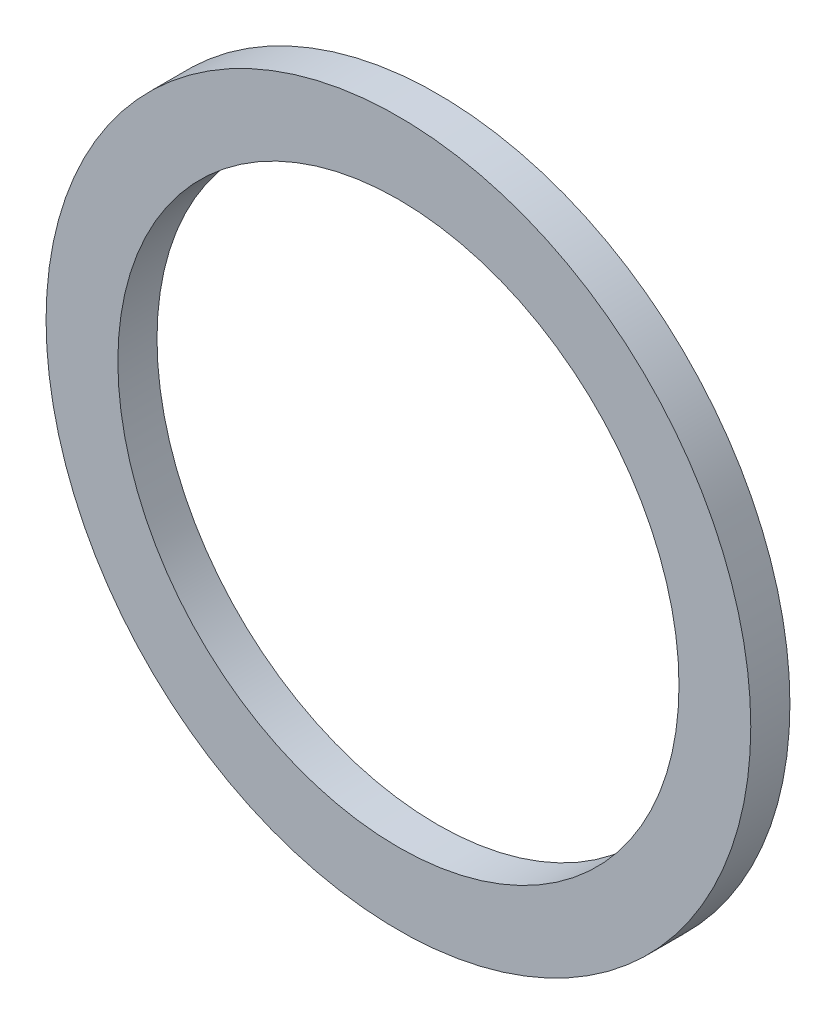
ISO-10303-21;
HEADER;
FILE_DESCRIPTION(('STEP AP214'),'2;1');
FILE_NAME('part.step','',(''),(''),'','','');
FILE_SCHEMA(('AUTOMOTIVE_DESIGN { 1 0 10303 214 1 1 1 1 }'));
ENDSEC;
DATA;
#1=APPLICATION_CONTEXT('core data for automotive mechanical design processes');
#2=APPLICATION_PROTOCOL_DEFINITION('international standard','automotive_design',2000,#1);
#3=PRODUCT_CONTEXT('',#1,'mechanical');
#4=PRODUCT('Part','Part','',(#3));
#5=PRODUCT_RELATED_PRODUCT_CATEGORY('part','',(#4));
#6=PRODUCT_DEFINITION_FORMATION('','',#4);
#7=PRODUCT_DEFINITION_CONTEXT('part definition',#1,'design');
#8=PRODUCT_DEFINITION('design','',#6,#7);
#9=PRODUCT_DEFINITION_SHAPE('','',#8);
#10=(LENGTH_UNIT() NAMED_UNIT(*) SI_UNIT(.MILLI.,.METRE.));
#11=(NAMED_UNIT(*) PLANE_ANGLE_UNIT() SI_UNIT($,.RADIAN.));
#12=(NAMED_UNIT(*) SI_UNIT($,.STERADIAN.) SOLID_ANGLE_UNIT());
#13=UNCERTAINTY_MEASURE_WITH_UNIT(LENGTH_MEASURE(1.E-05),#10,'distance_accuracy_value','');
#14=(GEOMETRIC_REPRESENTATION_CONTEXT(3) GLOBAL_UNCERTAINTY_ASSIGNED_CONTEXT((#13)) GLOBAL_UNIT_ASSIGNED_CONTEXT((#10,
#11,#12)) REPRESENTATION_CONTEXT('',''));
#15=CARTESIAN_POINT('',(0.,0.,0.));
#16=DIRECTION('',(0.,0.,1.));
#17=DIRECTION('',(1.,0.,0.));
#18=AXIS2_PLACEMENT_3D('',#15,#16,#17);
#19=CARTESIAN_POINT('',(0.,0.,1.5));
#20=DIRECTION('',(0.,0.,1.));
#21=DIRECTION('',(1.,0.,0.));
#22=AXIS2_PLACEMENT_3D('',#19,#20,#21);
#23=PLANE('',#22);
#24=CARTESIAN_POINT('',(0.,0.,1.5));
#25=DIRECTION('',(0.,0.,1.));
#26=DIRECTION('',(1.,0.,0.));
#27=AXIS2_PLACEMENT_3D('',#24,#25,#26);
#28=CIRCLE('',#27,13.5);
#29=CARTESIAN_POINT('',(13.5,0.,1.5));
#30=VERTEX_POINT('',#29);
#31=EDGE_CURVE('E10',#30,#30,#28,.T.);
#32=ORIENTED_EDGE('',*,*,#31,.T.);
#33=EDGE_LOOP('',(#32));
#34=FACE_BOUND('',#33,.T.);
#35=CARTESIAN_POINT('',(0.,0.,1.5));
#36=DIRECTION('',(0.,0.,1.));
#37=DIRECTION('',(1.,0.,0.));
#38=AXIS2_PLACEMENT_3D('',#35,#36,#37);
#39=CIRCLE('',#38,10.75);
#40=CARTESIAN_POINT('',(10.75,0.,1.5));
#41=VERTEX_POINT('',#40);
#42=EDGE_CURVE('E42',#41,#41,#39,.T.);
#43=ORIENTED_EDGE('',*,*,#42,.F.);
#44=EDGE_LOOP('',(#43));
#45=FACE_BOUND('',#44,.T.);
#46=ADVANCED_FACE('F31',(#34,#45),#23,.T.);
#47=CARTESIAN_POINT('',(0.,0.,0.));
#48=DIRECTION('',(0.,0.,1.));
#49=DIRECTION('',(1.,0.,0.));
#50=AXIS2_PLACEMENT_3D('',#47,#48,#49);
#51=PLANE('',#50);
#52=CARTESIAN_POINT('',(0.,0.,0.));
#53=DIRECTION('',(0.,0.,1.));
#54=DIRECTION('',(1.,0.,0.));
#55=AXIS2_PLACEMENT_3D('',#52,#53,#54);
#56=CIRCLE('',#55,13.5);
#57=CARTESIAN_POINT('',(13.5,0.,0.));
#58=VERTEX_POINT('',#57);
#59=EDGE_CURVE('E35',#58,#58,#56,.T.);
#60=ORIENTED_EDGE('',*,*,#59,.F.);
#61=EDGE_LOOP('',(#60));
#62=FACE_BOUND('',#61,.T.);
#63=CARTESIAN_POINT('',(0.,0.,0.));
#64=DIRECTION('',(0.,0.,1.));
#65=DIRECTION('',(1.,0.,0.));
#66=AXIS2_PLACEMENT_3D('',#63,#64,#65);
#67=CIRCLE('',#66,10.75);
#68=CARTESIAN_POINT('',(10.75,0.,0.));
#69=VERTEX_POINT('',#68);
#70=EDGE_CURVE('E44',#69,#69,#67,.T.);
#71=ORIENTED_EDGE('',*,*,#70,.T.);
#72=EDGE_LOOP('',(#71));
#73=FACE_BOUND('',#72,.T.);
#74=ADVANCED_FACE('F54',(#62,#73),#51,.F.);
#75=CARTESIAN_POINT('',(0.,0.,1.5));
#76=DIRECTION('',(0.,0.,-1.));
#77=DIRECTION('',(-1.,0.,0.));
#78=AXIS2_PLACEMENT_3D('',#75,#76,#77);
#79=CYLINDRICAL_SURFACE('',#78,13.5);
#80=ORIENTED_EDGE('',*,*,#31,.F.);
#81=EDGE_LOOP('',(#80));
#82=FACE_BOUND('',#81,.T.);
#83=ORIENTED_EDGE('',*,*,#59,.T.);
#84=EDGE_LOOP('',(#83));
#85=FACE_BOUND('',#84,.T.);
#86=ADVANCED_FACE('F33',(#82,#85),#79,.T.);
#87=CARTESIAN_POINT('',(0.,0.,1.5));
#88=DIRECTION('',(0.,0.,-1.));
#89=DIRECTION('',(-1.,0.,0.));
#90=AXIS2_PLACEMENT_3D('',#87,#88,#89);
#91=CYLINDRICAL_SURFACE('',#90,10.75);
#92=ORIENTED_EDGE('',*,*,#42,.T.);
#93=EDGE_LOOP('',(#92));
#94=FACE_BOUND('',#93,.T.);
#95=ORIENTED_EDGE('',*,*,#70,.F.);
#96=EDGE_LOOP('',(#95));
#97=FACE_BOUND('',#96,.T.);
#98=ADVANCED_FACE('F50',(#94,#97),#91,.F.);
#99=CLOSED_SHELL('',(#46,#74,#86,#98));
#100=MANIFOLD_SOLID_BREP('B2',#99);
#101=ADVANCED_BREP_SHAPE_REPRESENTATION('',(#18,#100),#14);
#102=SHAPE_DEFINITION_REPRESENTATION(#9,#101);
ENDSEC;
END-ISO-10303-21;
